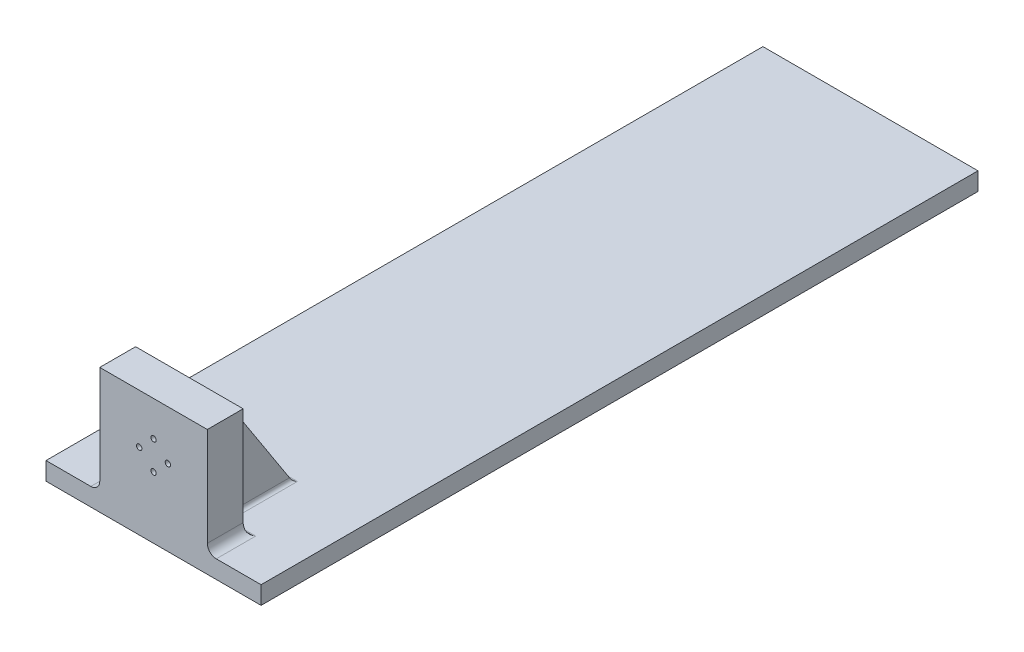
ISO-10303-21;
HEADER;
FILE_DESCRIPTION(('STEP AP214'),'2;1');
FILE_NAME('part.step','',(''),(''),'','','');
FILE_SCHEMA(('AUTOMOTIVE_DESIGN { 1 0 10303 214 1 1 1 1 }'));
ENDSEC;
DATA;
#1=APPLICATION_CONTEXT('core data for automotive mechanical design processes');
#2=APPLICATION_PROTOCOL_DEFINITION('international standard','automotive_design',2000,#1);
#3=PRODUCT_CONTEXT('',#1,'mechanical');
#4=PRODUCT('Part','Part','',(#3));
#5=PRODUCT_RELATED_PRODUCT_CATEGORY('part','',(#4));
#6=PRODUCT_DEFINITION_FORMATION('','',#4);
#7=PRODUCT_DEFINITION_CONTEXT('part definition',#1,'design');
#8=PRODUCT_DEFINITION('design','',#6,#7);
#9=PRODUCT_DEFINITION_SHAPE('','',#8);
#10=(LENGTH_UNIT() NAMED_UNIT(*) SI_UNIT(.MILLI.,.METRE.));
#11=(NAMED_UNIT(*) PLANE_ANGLE_UNIT() SI_UNIT($,.RADIAN.));
#12=(NAMED_UNIT(*) SI_UNIT($,.STERADIAN.) SOLID_ANGLE_UNIT());
#13=UNCERTAINTY_MEASURE_WITH_UNIT(LENGTH_MEASURE(1.E-05),#10,'distance_accuracy_value','');
#14=(GEOMETRIC_REPRESENTATION_CONTEXT(3) GLOBAL_UNCERTAINTY_ASSIGNED_CONTEXT((#13)) GLOBAL_UNIT_ASSIGNED_CONTEXT((#10,
#11,#12)) REPRESENTATION_CONTEXT('',''));
#15=CARTESIAN_POINT('',(0.,0.,0.));
#16=DIRECTION('',(0.,0.,1.));
#17=DIRECTION('',(1.,0.,0.));
#18=AXIS2_PLACEMENT_3D('',#15,#16,#17);
#19=CARTESIAN_POINT('',(-30.,70.,180.));
#20=DIRECTION('',(0.,0.,1.));
#21=DIRECTION('',(1.,0.,0.));
#22=AXIS2_PLACEMENT_3D('',#19,#20,#21);
#23=PLANE('',#22);
#24=CARTESIAN_POINT('',(0.,50.5,180.));
#25=DIRECTION('',(0.,0.,1.));
#26=DIRECTION('',(1.,0.,0.));
#27=AXIS2_PLACEMENT_3D('',#24,#25,#26);
#28=CIRCLE('',#27,1.5);
#29=CARTESIAN_POINT('',(1.50000000000009,50.5,180.));
#30=VERTEX_POINT('',#29);
#31=EDGE_CURVE('E341',#30,#30,#28,.T.);
#32=ORIENTED_EDGE('',*,*,#31,.T.);
#33=EDGE_LOOP('',(#32));
#34=FACE_BOUND('',#33,.T.);
#35=CARTESIAN_POINT('',(-7.9999999999999,42.5,180.));
#36=DIRECTION('',(0.,0.,1.));
#37=DIRECTION('',(1.,0.,0.));
#38=AXIS2_PLACEMENT_3D('',#35,#36,#37);
#39=CIRCLE('',#38,1.5);
#40=CARTESIAN_POINT('',(-6.4999999999999,42.5,180.));
#41=VERTEX_POINT('',#40);
#42=EDGE_CURVE('E337',#41,#41,#39,.T.);
#43=ORIENTED_EDGE('',*,*,#42,.T.);
#44=EDGE_LOOP('',(#43));
#45=FACE_BOUND('',#44,.T.);
#46=CARTESIAN_POINT('',(0.,34.5,180.));
#47=DIRECTION('',(0.,0.,1.));
#48=DIRECTION('',(1.,0.,0.));
#49=AXIS2_PLACEMENT_3D('',#46,#47,#48);
#50=CIRCLE('',#49,1.5);
#51=CARTESIAN_POINT('',(1.50000000000009,34.5,180.));
#52=VERTEX_POINT('',#51);
#53=EDGE_CURVE('E332',#52,#52,#50,.T.);
#54=ORIENTED_EDGE('',*,*,#53,.T.);
#55=EDGE_LOOP('',(#54));
#56=FACE_BOUND('',#55,.T.);
#57=CARTESIAN_POINT('',(7.99999999999996,42.5,180.));
#58=DIRECTION('',(0.,0.,1.));
#59=DIRECTION('',(1.,0.,0.));
#60=AXIS2_PLACEMENT_3D('',#57,#58,#59);
#61=CIRCLE('',#60,1.5);
#62=CARTESIAN_POINT('',(9.49999999999996,42.5,180.));
#63=VERTEX_POINT('',#62);
#64=EDGE_CURVE('E328',#63,#63,#61,.T.);
#65=ORIENTED_EDGE('',*,*,#64,.T.);
#66=EDGE_LOOP('',(#65));
#67=FACE_BOUND('',#66,.T.);
#68=DIRECTION('',(-1.,0.,0.));
#69=VECTOR('',#68,1.);
#70=CARTESIAN_POINT('',(-30.,12.,180.));
#71=LINE('',#70,#69);
#72=CARTESIAN_POINT('',(9.75000000000004,12.,180.));
#73=VERTEX_POINT('',#72);
#74=CARTESIAN_POINT('',(-9.75000000000004,12.,180.));
#75=VERTEX_POINT('',#74);
#76=EDGE_CURVE('E393',#73,#75,#71,.T.);
#77=ORIENTED_EDGE('',*,*,#76,.T.);
#78=DIRECTION('',(0.,-1.,0.));
#79=VECTOR('',#78,1.);
#80=CARTESIAN_POINT('',(-9.75000000000004,70.,180.));
#81=LINE('',#80,#79);
#82=CARTESIAN_POINT('',(-9.75000000000004,70.,180.));
#83=VERTEX_POINT('',#82);
#84=EDGE_CURVE('E396',#75,#83,#81,.F.);
#85=ORIENTED_EDGE('',*,*,#84,.T.);
#86=DIRECTION('',(-1.,0.,0.));
#87=VECTOR('',#86,1.);
#88=CARTESIAN_POINT('',(-30.,70.,180.));
#89=LINE('',#88,#87);
#90=CARTESIAN_POINT('',(9.75000000000004,70.,180.));
#91=VERTEX_POINT('',#90);
#92=EDGE_CURVE('E231',#91,#83,#89,.T.);
#93=ORIENTED_EDGE('',*,*,#92,.F.);
#94=DIRECTION('',(0.,1.,0.));
#95=VECTOR('',#94,1.);
#96=CARTESIAN_POINT('',(9.75000000000004,10.,180.));
#97=LINE('',#96,#95);
#98=EDGE_CURVE('E390',#91,#73,#97,.F.);
#99=ORIENTED_EDGE('',*,*,#98,.T.);
#100=EDGE_LOOP('',(#77,#85,#93,#99));
#101=FACE_BOUND('',#100,.T.);
#102=ADVANCED_FACE('F47',(#34,#45,#56,#67,#101),#23,.F.);
#103=CARTESIAN_POINT('',(-20.25,70.,180.));
#104=VERTEX_POINT('',#103);
#105=CARTESIAN_POINT('',(-30.,70.,180.));
#106=VERTEX_POINT('',#105);
#107=EDGE_CURVE('E241',#104,#106,#89,.T.);
#108=ORIENTED_EDGE('',*,*,#107,.F.);
#109=DIRECTION('',(0.,-1.,0.));
#110=VECTOR('',#109,1.);
#111=CARTESIAN_POINT('',(-20.25,70.,180.));
#112=LINE('',#111,#110);
#113=CARTESIAN_POINT('',(-20.25,10.,180.));
#114=VERTEX_POINT('',#113);
#115=EDGE_CURVE('E375',#104,#114,#112,.T.);
#116=ORIENTED_EDGE('',*,*,#115,.T.);
#117=DIRECTION('',(-1.,0.,0.));
#118=VECTOR('',#117,1.);
#119=CARTESIAN_POINT('',(-30.,10.,180.));
#120=LINE('',#119,#118);
#121=CARTESIAN_POINT('',(-35.,10.,180.));
#122=VERTEX_POINT('',#121);
#123=EDGE_CURVE('E242',#114,#122,#120,.T.);
#124=ORIENTED_EDGE('',*,*,#123,.T.);
#125=CARTESIAN_POINT('',(-35.,15.,180.));
#126=DIRECTION('',(0.,0.,1.));
#127=DIRECTION('',(1.,0.,0.));
#128=AXIS2_PLACEMENT_3D('',#125,#126,#127);
#129=CIRCLE('',#128,5.);
#130=CARTESIAN_POINT('',(-30.,15.,180.));
#131=VERTEX_POINT('',#130);
#132=EDGE_CURVE('E324',#122,#131,#129,.T.);
#133=ORIENTED_EDGE('',*,*,#132,.T.);
#134=DIRECTION('',(0.,-1.,0.));
#135=VECTOR('',#134,1.);
#136=CARTESIAN_POINT('',(-30.,70.,180.));
#137=LINE('',#136,#135);
#138=EDGE_CURVE('E250',#106,#131,#137,.T.);
#139=ORIENTED_EDGE('',*,*,#138,.F.);
#140=EDGE_LOOP('',(#108,#116,#124,#133,#139));
#141=FACE_BOUND('',#140,.T.);
#142=ADVANCED_FACE('F503',(#141),#23,.F.);
#143=CARTESIAN_POINT('',(60.,0.,200.));
#144=DIRECTION('',(1.,0.,0.));
#145=DIRECTION('',(0.,0.,-1.));
#146=AXIS2_PLACEMENT_3D('',#143,#144,#145);
#147=PLANE('',#146);
#148=DIRECTION('',(0.,1.,0.));
#149=VECTOR('',#148,1.);
#150=CARTESIAN_POINT('',(60.,0.,200.));
#151=LINE('',#150,#149);
#152=CARTESIAN_POINT('',(60.,0.,200.));
#153=VERTEX_POINT('',#152);
#154=CARTESIAN_POINT('',(60.,10.,200.));
#155=VERTEX_POINT('',#154);
#156=EDGE_CURVE('E296',#153,#155,#151,.T.);
#157=ORIENTED_EDGE('',*,*,#156,.F.);
#158=DIRECTION('',(0.,0.,-1.));
#159=VECTOR('',#158,1.);
#160=CARTESIAN_POINT('',(60.,0.,200.));
#161=LINE('',#160,#159);
#162=CARTESIAN_POINT('',(60.,0.,-200.));
#163=VERTEX_POINT('',#162);
#164=EDGE_CURVE('E283',#153,#163,#161,.T.);
#165=ORIENTED_EDGE('',*,*,#164,.T.);
#166=DIRECTION('',(0.,1.,0.));
#167=VECTOR('',#166,1.);
#168=CARTESIAN_POINT('',(60.,0.,-200.));
#169=LINE('',#168,#167);
#170=CARTESIAN_POINT('',(60.,10.,-200.));
#171=VERTEX_POINT('',#170);
#172=EDGE_CURVE('E293',#163,#171,#169,.T.);
#173=ORIENTED_EDGE('',*,*,#172,.T.);
#174=DIRECTION('',(0.,0.,1.));
#175=VECTOR('',#174,1.);
#176=CARTESIAN_POINT('',(60.,10.,0.));
#177=LINE('',#176,#175);
#178=EDGE_CURVE('E273',#155,#171,#177,.F.);
#179=ORIENTED_EDGE('',*,*,#178,.F.);
#180=EDGE_LOOP('',(#157,#165,#173,#179));
#181=FACE_BOUND('',#180,.T.);
#182=ADVANCED_FACE('F510',(#181),#147,.T.);
#183=CARTESIAN_POINT('',(60.,0.,-200.));
#184=DIRECTION('',(0.,0.,-1.));
#185=DIRECTION('',(-1.,0.,0.));
#186=AXIS2_PLACEMENT_3D('',#183,#184,#185);
#187=PLANE('',#186);
#188=ORIENTED_EDGE('',*,*,#172,.F.);
#189=DIRECTION('',(-1.,0.,0.));
#190=VECTOR('',#189,1.);
#191=CARTESIAN_POINT('',(60.,0.,-200.));
#192=LINE('',#191,#190);
#193=CARTESIAN_POINT('',(-60.,0.,-200.));
#194=VERTEX_POINT('',#193);
#195=EDGE_CURVE('E267',#163,#194,#192,.T.);
#196=ORIENTED_EDGE('',*,*,#195,.T.);
#197=DIRECTION('',(0.,1.,0.));
#198=VECTOR('',#197,1.);
#199=CARTESIAN_POINT('',(-60.,0.,-200.));
#200=LINE('',#199,#198);
#201=CARTESIAN_POINT('',(-60.,10.,-200.));
#202=VERTEX_POINT('',#201);
#203=EDGE_CURVE('E290',#194,#202,#200,.T.);
#204=ORIENTED_EDGE('',*,*,#203,.T.);
#205=DIRECTION('',(1.,0.,0.));
#206=VECTOR('',#205,1.);
#207=CARTESIAN_POINT('',(0.,10.,-200.));
#208=LINE('',#207,#206);
#209=EDGE_CURVE('E268',#171,#202,#208,.F.);
#210=ORIENTED_EDGE('',*,*,#209,.F.);
#211=EDGE_LOOP('',(#188,#196,#204,#210));
#212=FACE_BOUND('',#211,.T.);
#213=ADVANCED_FACE('F536',(#212),#187,.T.);
#214=CARTESIAN_POINT('',(-60.,0.,200.));
#215=DIRECTION('',(-1.,0.,0.));
#216=DIRECTION('',(0.,0.,1.));
#217=AXIS2_PLACEMENT_3D('',#214,#215,#216);
#218=PLANE('',#217);
#219=ORIENTED_EDGE('',*,*,#203,.F.);
#220=DIRECTION('',(0.,0.,1.));
#221=VECTOR('',#220,1.);
#222=CARTESIAN_POINT('',(-60.,0.,200.));
#223=LINE('',#222,#221);
#224=CARTESIAN_POINT('',(-60.,0.,200.));
#225=VERTEX_POINT('',#224);
#226=EDGE_CURVE('E249',#194,#225,#223,.T.);
#227=ORIENTED_EDGE('',*,*,#226,.T.);
#228=DIRECTION('',(0.,1.,0.));
#229=VECTOR('',#228,1.);
#230=CARTESIAN_POINT('',(-60.,0.,200.));
#231=LINE('',#230,#229);
#232=CARTESIAN_POINT('',(-60.,10.,200.));
#233=VERTEX_POINT('',#232);
#234=EDGE_CURVE('E272',#225,#233,#231,.T.);
#235=ORIENTED_EDGE('',*,*,#234,.T.);
#236=DIRECTION('',(0.,0.,1.));
#237=VECTOR('',#236,1.);
#238=CARTESIAN_POINT('',(-60.,10.,0.));
#239=LINE('',#238,#237);
#240=EDGE_CURVE('E262',#202,#233,#239,.T.);
#241=ORIENTED_EDGE('',*,*,#240,.F.);
#242=EDGE_LOOP('',(#219,#227,#235,#241));
#243=FACE_BOUND('',#242,.T.);
#244=ADVANCED_FACE('F534',(#243),#218,.T.);
#245=CARTESIAN_POINT('',(60.,0.,200.));
#246=DIRECTION('',(0.,0.,1.));
#247=DIRECTION('',(1.,0.,0.));
#248=AXIS2_PLACEMENT_3D('',#245,#246,#247);
#249=PLANE('',#248);
#250=DIRECTION('',(1.,0.,0.));
#251=VECTOR('',#250,1.);
#252=CARTESIAN_POINT('',(60.,0.,200.));
#253=LINE('',#252,#251);
#254=EDGE_CURVE('E255',#225,#153,#253,.T.);
#255=ORIENTED_EDGE('',*,*,#254,.T.);
#256=ORIENTED_EDGE('',*,*,#156,.T.);
#257=DIRECTION('',(1.,0.,0.));
#258=VECTOR('',#257,1.);
#259=CARTESIAN_POINT('',(0.,10.,200.));
#260=LINE('',#259,#258);
#261=CARTESIAN_POINT('',(35.,10.,200.));
#262=VERTEX_POINT('',#261);
#263=EDGE_CURVE('E266',#262,#155,#260,.T.);
#264=ORIENTED_EDGE('',*,*,#263,.F.);
#265=CARTESIAN_POINT('',(35.,15.,200.));
#266=DIRECTION('',(0.,0.,1.));
#267=DIRECTION('',(1.,0.,0.));
#268=AXIS2_PLACEMENT_3D('',#265,#266,#267);
#269=CIRCLE('',#268,5.);
#270=CARTESIAN_POINT('',(30.0000000000001,15.,200.));
#271=VERTEX_POINT('',#270);
#272=EDGE_CURVE('E318',#262,#271,#269,.F.);
#273=ORIENTED_EDGE('',*,*,#272,.T.);
#274=DIRECTION('',(0.,-1.,0.));
#275=VECTOR('',#274,1.);
#276=CARTESIAN_POINT('',(30.0000000000001,70.,200.));
#277=LINE('',#276,#275);
#278=CARTESIAN_POINT('',(30.0000000000001,70.,200.));
#279=VERTEX_POINT('',#278);
#280=EDGE_CURVE('E649',#279,#271,#277,.T.);
#281=ORIENTED_EDGE('',*,*,#280,.F.);
#282=DIRECTION('',(1.,0.,0.));
#283=VECTOR('',#282,1.);
#284=CARTESIAN_POINT('',(-30.,70.,200.));
#285=LINE('',#284,#283);
#286=CARTESIAN_POINT('',(-30.,70.,200.));
#287=VERTEX_POINT('',#286);
#288=EDGE_CURVE('E236',#287,#279,#285,.T.);
#289=ORIENTED_EDGE('',*,*,#288,.F.);
#290=DIRECTION('',(0.,-1.,0.));
#291=VECTOR('',#290,1.);
#292=CARTESIAN_POINT('',(-30.,70.,200.));
#293=LINE('',#292,#291);
#294=CARTESIAN_POINT('',(-30.,15.,200.));
#295=VERTEX_POINT('',#294);
#296=EDGE_CURVE('E258',#287,#295,#293,.T.);
#297=ORIENTED_EDGE('',*,*,#296,.T.);
#298=CARTESIAN_POINT('',(-35.,15.,200.));
#299=DIRECTION('',(0.,0.,1.));
#300=DIRECTION('',(1.,0.,0.));
#301=AXIS2_PLACEMENT_3D('',#298,#299,#300);
#302=CIRCLE('',#301,5.);
#303=CARTESIAN_POINT('',(-35.,10.,200.));
#304=VERTEX_POINT('',#303);
#305=EDGE_CURVE('E321',#295,#304,#302,.F.);
#306=ORIENTED_EDGE('',*,*,#305,.T.);
#307=EDGE_CURVE('E277',#233,#304,#260,.T.);
#308=ORIENTED_EDGE('',*,*,#307,.F.);
#309=ORIENTED_EDGE('',*,*,#234,.F.);
#310=EDGE_LOOP('',(#255,#256,#264,#273,#281,#289,#297,#306,#308,#309));
#311=FACE_BOUND('',#310,.T.);
#312=CARTESIAN_POINT('',(0.,50.5,200.));
#313=DIRECTION('',(0.,0.,1.));
#314=DIRECTION('',(1.,0.,0.));
#315=AXIS2_PLACEMENT_3D('',#312,#313,#314);
#316=CIRCLE('',#315,1.5);
#317=CARTESIAN_POINT('',(1.50000000000009,50.5,200.));
#318=VERTEX_POINT('',#317);
#319=EDGE_CURVE('E333',#318,#318,#316,.T.);
#320=ORIENTED_EDGE('',*,*,#319,.F.);
#321=EDGE_LOOP('',(#320));
#322=FACE_BOUND('',#321,.T.);
#323=CARTESIAN_POINT('',(-7.9999999999999,42.5,200.));
#324=DIRECTION('',(0.,0.,1.));
#325=DIRECTION('',(1.,0.,0.));
#326=AXIS2_PLACEMENT_3D('',#323,#324,#325);
#327=CIRCLE('',#326,1.5);
#328=CARTESIAN_POINT('',(-6.4999999999999,42.5,200.));
#329=VERTEX_POINT('',#328);
#330=EDGE_CURVE('E634',#329,#329,#327,.T.);
#331=ORIENTED_EDGE('',*,*,#330,.F.);
#332=EDGE_LOOP('',(#331));
#333=FACE_BOUND('',#332,.T.);
#334=CARTESIAN_POINT('',(0.,34.5,200.));
#335=DIRECTION('',(0.,0.,1.));
#336=DIRECTION('',(-1.,0.,0.));
#337=AXIS2_PLACEMENT_3D('',#334,#335,#336);
#338=CIRCLE('',#337,1.5);
#339=CARTESIAN_POINT('',(-1.49999999999991,34.5,200.));
#340=VERTEX_POINT('',#339);
#341=EDGE_CURVE('E638',#340,#340,#338,.T.);
#342=ORIENTED_EDGE('',*,*,#341,.F.);
#343=EDGE_LOOP('',(#342));
#344=FACE_BOUND('',#343,.T.);
#345=CARTESIAN_POINT('',(7.99999999999996,42.5,200.));
#346=DIRECTION('',(0.,0.,1.));
#347=DIRECTION('',(-1.,0.,0.));
#348=AXIS2_PLACEMENT_3D('',#345,#346,#347);
#349=CIRCLE('',#348,1.5);
#350=CARTESIAN_POINT('',(6.49999999999996,42.5,200.));
#351=VERTEX_POINT('',#350);
#352=EDGE_CURVE('E627',#351,#351,#349,.T.);
#353=ORIENTED_EDGE('',*,*,#352,.F.);
#354=EDGE_LOOP('',(#353));
#355=FACE_BOUND('',#354,.T.);
#356=ADVANCED_FACE('F461',(#311,#322,#333,#344,#355),#249,.T.);
#357=CARTESIAN_POINT('',(0.,10.,0.));
#358=DIRECTION('',(0.,1.,0.));
#359=DIRECTION('',(0.,0.,1.));
#360=AXIS2_PLACEMENT_3D('',#357,#358,#359);
#361=PLANE('',#360);
#362=ORIENTED_EDGE('',*,*,#123,.F.);
#363=DIRECTION('',(0.,0.,1.));
#364=VECTOR('',#363,1.);
#365=CARTESIAN_POINT('',(-20.25,10.,141.081350869608));
#366=LINE('',#365,#364);
#367=CARTESIAN_POINT('',(-20.25,10.,139.994743843913));
#368=VERTEX_POINT('',#367);
#369=EDGE_CURVE('E369',#114,#368,#366,.F.);
#370=ORIENTED_EDGE('',*,*,#369,.T.);
#371=DIRECTION('',(-1.,0.,0.));
#372=VECTOR('',#371,1.);
#373=CARTESIAN_POINT('',(-11.75,10.,139.994743843913));
#374=LINE('',#373,#372);
#375=CARTESIAN_POINT('',(-9.75000000000003,10.,139.994743843913));
#376=VERTEX_POINT('',#375);
#377=EDGE_CURVE('E366',#368,#376,#374,.F.);
#378=ORIENTED_EDGE('',*,*,#377,.T.);
#379=DIRECTION('',(0.,0.,1.));
#380=VECTOR('',#379,1.);
#381=CARTESIAN_POINT('',(-9.75000000000001,10.,0.));
#382=LINE('',#381,#380);
#383=CARTESIAN_POINT('',(-9.75000000000004,10.,178.));
#384=VERTEX_POINT('',#383);
#385=EDGE_CURVE('E363',#376,#384,#382,.T.);
#386=ORIENTED_EDGE('',*,*,#385,.T.);
#387=DIRECTION('',(-1.,0.,0.));
#388=VECTOR('',#387,1.);
#389=CARTESIAN_POINT('',(0.,10.,178.));
#390=LINE('',#389,#388);
#391=CARTESIAN_POINT('',(9.75000000000004,10.,178.));
#392=VERTEX_POINT('',#391);
#393=EDGE_CURVE('E360',#384,#392,#390,.F.);
#394=ORIENTED_EDGE('',*,*,#393,.T.);
#395=DIRECTION('',(0.,0.,-1.));
#396=VECTOR('',#395,1.);
#397=CARTESIAN_POINT('',(9.75000000000001,10.,0.));
#398=LINE('',#397,#396);
#399=CARTESIAN_POINT('',(9.75000000000003,10.,139.994743843913));
#400=VERTEX_POINT('',#399);
#401=EDGE_CURVE('E357',#392,#400,#398,.T.);
#402=ORIENTED_EDGE('',*,*,#401,.T.);
#403=DIRECTION('',(1.,0.,0.));
#404=VECTOR('',#403,1.);
#405=CARTESIAN_POINT('',(18.25,10.,139.994743843913));
#406=LINE('',#405,#404);
#407=CARTESIAN_POINT('',(20.25,10.,139.994743843913));
#408=VERTEX_POINT('',#407);
#409=EDGE_CURVE('E354',#400,#408,#406,.T.);
#410=ORIENTED_EDGE('',*,*,#409,.T.);
#411=DIRECTION('',(0.,0.,-1.));
#412=VECTOR('',#411,1.);
#413=CARTESIAN_POINT('',(20.25,10.,180.));
#414=LINE('',#413,#412);
#415=CARTESIAN_POINT('',(20.25,10.,178.));
#416=VERTEX_POINT('',#415);
#417=EDGE_CURVE('E351',#408,#416,#414,.F.);
#418=ORIENTED_EDGE('',*,*,#417,.T.);
#419=DIRECTION('',(-1.,0.,0.));
#420=VECTOR('',#419,1.);
#421=CARTESIAN_POINT('',(0.,10.,178.));
#422=LINE('',#421,#420);
#423=CARTESIAN_POINT('',(35.,10.,178.));
#424=VERTEX_POINT('',#423);
#425=EDGE_CURVE('E347',#416,#424,#422,.F.);
#426=ORIENTED_EDGE('',*,*,#425,.T.);
#427=DIRECTION('',(0.,0.,-1.));
#428=VECTOR('',#427,1.);
#429=CARTESIAN_POINT('',(35.,10.,0.));
#430=LINE('',#429,#428);
#431=EDGE_CURVE('E308',#424,#262,#430,.F.);
#432=ORIENTED_EDGE('',*,*,#431,.T.);
#433=ORIENTED_EDGE('',*,*,#263,.T.);
#434=ORIENTED_EDGE('',*,*,#178,.T.);
#435=ORIENTED_EDGE('',*,*,#209,.T.);
#436=ORIENTED_EDGE('',*,*,#240,.T.);
#437=ORIENTED_EDGE('',*,*,#307,.T.);
#438=DIRECTION('',(0.,0.,1.));
#439=VECTOR('',#438,1.);
#440=CARTESIAN_POINT('',(-35.,10.,0.));
#441=LINE('',#440,#439);
#442=EDGE_CURVE('E304',#304,#122,#441,.F.);
#443=ORIENTED_EDGE('',*,*,#442,.T.);
#444=EDGE_LOOP('',(#362,#370,#378,#386,#394,#402,#410,#418,#426,#432,#433,#434,#435,#436,#437,#443));
#445=FACE_BOUND('',#444,.T.);
#446=ADVANCED_FACE('F528',(#445),#361,.T.);
#447=CARTESIAN_POINT('',(0.,0.,0.));
#448=DIRECTION('',(0.,1.,0.));
#449=DIRECTION('',(0.,0.,1.));
#450=AXIS2_PLACEMENT_3D('',#447,#448,#449);
#451=PLANE('',#450);
#452=ORIENTED_EDGE('',*,*,#164,.F.);
#453=ORIENTED_EDGE('',*,*,#254,.F.);
#454=ORIENTED_EDGE('',*,*,#226,.F.);
#455=ORIENTED_EDGE('',*,*,#195,.F.);
#456=EDGE_LOOP('',(#452,#453,#454,#455));
#457=FACE_BOUND('',#456,.T.);
#458=ADVANCED_FACE('F524',(#457),#451,.F.);
#459=CARTESIAN_POINT('',(30.,70.,180.));
#460=DIRECTION('',(-1.,0.,0.));
#461=DIRECTION('',(0.,0.,1.));
#462=AXIS2_PLACEMENT_3D('',#459,#460,#461);
#463=PLANE('',#462);
#464=ORIENTED_EDGE('',*,*,#280,.T.);
#465=DIRECTION('',(0.,0.,-1.));
#466=VECTOR('',#465,1.);
#467=CARTESIAN_POINT('',(30.,15.,180.));
#468=LINE('',#467,#466);
#469=CARTESIAN_POINT('',(30.,15.,180.));
#470=VERTEX_POINT('',#469);
#471=EDGE_CURVE('E247',#271,#470,#468,.T.);
#472=ORIENTED_EDGE('',*,*,#471,.T.);
#473=DIRECTION('',(0.,-1.,0.));
#474=VECTOR('',#473,1.);
#475=CARTESIAN_POINT('',(30.,70.,180.));
#476=LINE('',#475,#474);
#477=CARTESIAN_POINT('',(30.,70.,180.));
#478=VERTEX_POINT('',#477);
#479=EDGE_CURVE('E224',#478,#470,#476,.T.);
#480=ORIENTED_EDGE('',*,*,#479,.F.);
#481=DIRECTION('',(0.,0.,-1.));
#482=VECTOR('',#481,1.);
#483=CARTESIAN_POINT('',(30.,70.,180.));
#484=LINE('',#483,#482);
#485=EDGE_CURVE('E233',#279,#478,#484,.T.);
#486=ORIENTED_EDGE('',*,*,#485,.F.);
#487=EDGE_LOOP('',(#464,#472,#480,#486));
#488=FACE_BOUND('',#487,.T.);
#489=ADVANCED_FACE('F245',(#488),#463,.F.);
#490=CARTESIAN_POINT('',(35.,15.,180.));
#491=DIRECTION('',(0.,0.,1.));
#492=DIRECTION('',(1.,0.,0.));
#493=AXIS2_PLACEMENT_3D('',#490,#491,#492);
#494=CIRCLE('',#493,5.);
#495=CARTESIAN_POINT('',(31.,12.,180.));
#496=VERTEX_POINT('',#495);
#497=EDGE_CURVE('E315',#470,#496,#494,.T.);
#498=ORIENTED_EDGE('',*,*,#497,.T.);
#499=DIRECTION('',(-1.,0.,0.));
#500=VECTOR('',#499,1.);
#501=CARTESIAN_POINT('',(-30.,12.,180.));
#502=LINE('',#501,#500);
#503=CARTESIAN_POINT('',(20.25,12.,180.));
#504=VERTEX_POINT('',#503);
#505=EDGE_CURVE('E414',#496,#504,#502,.T.);
#506=ORIENTED_EDGE('',*,*,#505,.T.);
#507=DIRECTION('',(0.,1.,0.));
#508=VECTOR('',#507,1.);
#509=CARTESIAN_POINT('',(20.25,70.,180.));
#510=LINE('',#509,#508);
#511=CARTESIAN_POINT('',(20.25,70.,180.));
#512=VERTEX_POINT('',#511);
#513=EDGE_CURVE('E226',#504,#512,#510,.T.);
#514=ORIENTED_EDGE('',*,*,#513,.T.);
#515=EDGE_CURVE('E219',#478,#512,#89,.T.);
#516=ORIENTED_EDGE('',*,*,#515,.F.);
#517=ORIENTED_EDGE('',*,*,#479,.T.);
#518=EDGE_LOOP('',(#498,#506,#514,#516,#517));
#519=FACE_BOUND('',#518,.T.);
#520=ADVANCED_FACE('F222',(#519),#23,.F.);
#521=CARTESIAN_POINT('',(-30.,70.,180.));
#522=DIRECTION('',(1.,0.,0.));
#523=DIRECTION('',(0.,0.,-1.));
#524=AXIS2_PLACEMENT_3D('',#521,#522,#523);
#525=PLANE('',#524);
#526=ORIENTED_EDGE('',*,*,#138,.T.);
#527=DIRECTION('',(0.,0.,1.));
#528=VECTOR('',#527,1.);
#529=CARTESIAN_POINT('',(-30.,15.,180.));
#530=LINE('',#529,#528);
#531=EDGE_CURVE('E311',#131,#295,#530,.T.);
#532=ORIENTED_EDGE('',*,*,#531,.T.);
#533=ORIENTED_EDGE('',*,*,#296,.F.);
#534=DIRECTION('',(0.,0.,1.));
#535=VECTOR('',#534,1.);
#536=CARTESIAN_POINT('',(-30.,70.,180.));
#537=LINE('',#536,#535);
#538=EDGE_CURVE('E229',#106,#287,#537,.T.);
#539=ORIENTED_EDGE('',*,*,#538,.F.);
#540=EDGE_LOOP('',(#526,#532,#533,#539));
#541=FACE_BOUND('',#540,.T.);
#542=ADVANCED_FACE('F516',(#541),#525,.F.);
#543=CARTESIAN_POINT('',(0.,70.,0.));
#544=DIRECTION('',(0.,1.,0.));
#545=DIRECTION('',(0.,0.,1.));
#546=AXIS2_PLACEMENT_3D('',#543,#544,#545);
#547=PLANE('',#546);
#548=ORIENTED_EDGE('',*,*,#288,.T.);
#549=ORIENTED_EDGE('',*,*,#485,.T.);
#550=ORIENTED_EDGE('',*,*,#515,.T.);
#551=EDGE_CURVE('E66',#512,#91,#89,.T.);
#552=ORIENTED_EDGE('',*,*,#551,.T.);
#553=ORIENTED_EDGE('',*,*,#92,.T.);
#554=EDGE_CURVE('E715',#83,#104,#89,.T.);
#555=ORIENTED_EDGE('',*,*,#554,.T.);
#556=ORIENTED_EDGE('',*,*,#107,.T.);
#557=ORIENTED_EDGE('',*,*,#538,.T.);
#558=EDGE_LOOP('',(#548,#549,#550,#552,#553,#555,#556,#557));
#559=FACE_BOUND('',#558,.T.);
#560=ADVANCED_FACE('F234',(#559),#547,.T.);
#561=CARTESIAN_POINT('',(35.,15.,180.));
#562=DIRECTION('',(0.,0.,-1.));
#563=DIRECTION('',(-1.,0.,0.));
#564=AXIS2_PLACEMENT_3D('',#561,#562,#563);
#565=CYLINDRICAL_SURFACE('',#564,5.);
#566=ORIENTED_EDGE('',*,*,#272,.F.);
#567=ORIENTED_EDGE('',*,*,#431,.F.);
#568=CARTESIAN_POINT('',(31.,12.,180.));
#569=CARTESIAN_POINT('',(31.051291938938,11.9315858443193,179.999993240273));
#570=CARTESIAN_POINT('',(31.1043221905044,11.8645582185277,179.996491572034));
#571=CARTESIAN_POINT('',(31.2133273103346,11.7337630195359,179.983289097096));
#572=CARTESIAN_POINT('',(31.2692969306262,11.6699900118236,179.9735990156));
#573=CARTESIAN_POINT('',(31.3832847643709,11.5465415072406,179.948922812718));
#574=CARTESIAN_POINT('',(31.4412784471596,11.4868328230552,179.933987909531));
#575=CARTESIAN_POINT('',(31.5594732382407,11.3710020267293,179.899477725159));
#576=CARTESIAN_POINT('',(31.6196756241122,11.3148820435623,179.87989972132));
#577=CARTESIAN_POINT('',(31.767891438032,11.1833228460575,179.827555850942));
#578=CARTESIAN_POINT('',(31.856869793661,11.1097861813867,179.792718575294));
#579=CARTESIAN_POINT('',(32.0378149034014,10.9702943076288,179.716399415194));
#580=CARTESIAN_POINT('',(32.1297823955073,10.9043409893311,179.674915879745));
#581=CARTESIAN_POINT('',(32.410325680535,10.7169733012532,179.541888780418));
#582=CARTESIAN_POINT('',(32.6026488108277,10.6068318494825,179.442106107314));
#583=CARTESIAN_POINT('',(32.936006808688,10.4432848498546,179.259736400756));
#584=CARTESIAN_POINT('',(33.0756041550305,10.3827054455412,179.180646510725));
#585=CARTESIAN_POINT('',(33.3570864580454,10.2752228503533,179.017206242058));
#586=CARTESIAN_POINT('',(33.4989723932581,10.2283256825108,178.932853566475));
#587=CARTESIAN_POINT('',(33.7839512736836,10.1478758852136,178.76068856634));
#588=CARTESIAN_POINT('',(33.9270410934604,10.1142956946986,178.672883804921));
#589=CARTESIAN_POINT('',(34.2141274184521,10.0599857310582,178.494967808666));
#590=CARTESIAN_POINT('',(34.3581236186315,10.0392518461052,178.404857321471));
#591=CARTESIAN_POINT('',(34.6640741180227,10.0086525171965,178.212445214318));
#592=CARTESIAN_POINT('',(34.8260977800034,10.0004013073906,178.109985110391));
#593=CARTESIAN_POINT('',(34.9920318535134,10.0000047645927,178.005039497681));
#594=CARTESIAN_POINT('',(34.9960159521506,10.0000000029522,178.002519732425));
#595=CARTESIAN_POINT('',(35.,10.,178.));
#596=B_SPLINE_CURVE_WITH_KNOTS('',3,(#568,#569,#570,#571,#572,#573,#574,#575,#576,#577,#578,
#579,#580,#581,#582,#583,#584,#585,#586,#587,#588,#589,#590,#591,#592,#593,#594,#595),
.UNSPECIFIED.,.F.,.F.,(4,2,2,2,2,2,2,2,2,2,2,2,2,4),(0.,0.256323586120825,0.512204136350837,
0.765652360303645,1.01924957198093,1.38041574025915,1.74167176531578,2.4678409679054,
2.98178501814792,3.4959549705634,4.00905516339227,4.52199103886934,5.09684964624111,
5.11099178908029),.UNSPECIFIED.);
#597=EDGE_CURVE('E58',#424,#496,#596,.F.);
#598=ORIENTED_EDGE('',*,*,#597,.T.);
#599=ORIENTED_EDGE('',*,*,#497,.F.);
#600=ORIENTED_EDGE('',*,*,#471,.F.);
#601=EDGE_LOOP('',(#566,#567,#598,#599,#600));
#602=FACE_BOUND('',#601,.T.);
#603=ADVANCED_FACE('F454',(#602),#565,.F.);
#604=CARTESIAN_POINT('',(-35.,15.,180.));
#605=DIRECTION('',(0.,0.,1.));
#606=DIRECTION('',(1.,0.,0.));
#607=AXIS2_PLACEMENT_3D('',#604,#605,#606);
#608=CYLINDRICAL_SURFACE('',#607,5.);
#609=ORIENTED_EDGE('',*,*,#132,.F.);
#610=ORIENTED_EDGE('',*,*,#442,.F.);
#611=ORIENTED_EDGE('',*,*,#305,.F.);
#612=ORIENTED_EDGE('',*,*,#531,.F.);
#613=EDGE_LOOP('',(#609,#610,#611,#612));
#614=FACE_BOUND('',#613,.T.);
#615=ADVANCED_FACE('F459',(#614),#608,.F.);
#616=CARTESIAN_POINT('',(7.99999999999996,42.5,169.));
#617=DIRECTION('',(0.,0.,1.));
#618=DIRECTION('',(1.,0.,0.));
#619=AXIS2_PLACEMENT_3D('',#616,#617,#618);
#620=CYLINDRICAL_SURFACE('',#619,1.5);
#621=ORIENTED_EDGE('',*,*,#352,.T.);
#622=EDGE_LOOP('',(#621));
#623=FACE_BOUND('',#622,.T.);
#624=ORIENTED_EDGE('',*,*,#64,.F.);
#625=EDGE_LOOP('',(#624));
#626=FACE_BOUND('',#625,.T.);
#627=ADVANCED_FACE('F465',(#623,#626),#620,.F.);
#628=CARTESIAN_POINT('',(0.,34.5,169.));
#629=DIRECTION('',(0.,0.,1.));
#630=DIRECTION('',(1.,0.,0.));
#631=AXIS2_PLACEMENT_3D('',#628,#629,#630);
#632=CYLINDRICAL_SURFACE('',#631,1.5);
#633=ORIENTED_EDGE('',*,*,#341,.T.);
#634=EDGE_LOOP('',(#633));
#635=FACE_BOUND('',#634,.T.);
#636=ORIENTED_EDGE('',*,*,#53,.F.);
#637=EDGE_LOOP('',(#636));
#638=FACE_BOUND('',#637,.T.);
#639=ADVANCED_FACE('F750',(#635,#638),#632,.F.);
#640=CARTESIAN_POINT('',(-7.9999999999999,42.5,169.));
#641=DIRECTION('',(0.,0.,1.));
#642=DIRECTION('',(1.,0.,0.));
#643=AXIS2_PLACEMENT_3D('',#640,#641,#642);
#644=CYLINDRICAL_SURFACE('',#643,1.5);
#645=ORIENTED_EDGE('',*,*,#330,.T.);
#646=EDGE_LOOP('',(#645));
#647=FACE_BOUND('',#646,.T.);
#648=ORIENTED_EDGE('',*,*,#42,.F.);
#649=EDGE_LOOP('',(#648));
#650=FACE_BOUND('',#649,.T.);
#651=ADVANCED_FACE('F746',(#647,#650),#644,.F.);
#652=CARTESIAN_POINT('',(0.,50.5,169.));
#653=DIRECTION('',(0.,0.,1.));
#654=DIRECTION('',(1.,0.,0.));
#655=AXIS2_PLACEMENT_3D('',#652,#653,#654);
#656=CYLINDRICAL_SURFACE('',#655,1.5);
#657=ORIENTED_EDGE('',*,*,#319,.T.);
#658=EDGE_LOOP('',(#657));
#659=FACE_BOUND('',#658,.T.);
#660=ORIENTED_EDGE('',*,*,#31,.F.);
#661=EDGE_LOOP('',(#660));
#662=FACE_BOUND('',#661,.T.);
#663=ADVANCED_FACE('F743',(#659,#662),#656,.F.);
#664=CARTESIAN_POINT('',(15.,70.,180.));
#665=DIRECTION('',(0.,-0.544188449886251,0.838963009321865));
#666=DIRECTION('',(0.,-0.838963009321865,-0.544188449886251));
#667=AXIS2_PLACEMENT_3D('',#664,#665,#666);
#668=PLANE('',#667);
#669=DIRECTION('',(0.,-0.838963009321865,-0.544188449886251));
#670=VECTOR('',#669,1.);
#671=CARTESIAN_POINT('',(18.25,70.,180.));
#672=LINE('',#671,#670);
#673=CARTESIAN_POINT('',(18.25,66.9166452926473,178.));
#674=VERTEX_POINT('',#673);
#675=CARTESIAN_POINT('',(18.25,12.,142.378639173955));
#676=VERTEX_POINT('',#675);
#677=EDGE_CURVE('E623',#674,#676,#672,.T.);
#678=ORIENTED_EDGE('',*,*,#677,.T.);
#679=CARTESIAN_POINT('',(20.25,12.,142.378639173955));
#680=DIRECTION('',(0.,-0.544188449886251,0.838963009321865));
#681=DIRECTION('',(0.,0.838963009321865,0.544188449886251));
#682=AXIS2_PLACEMENT_3D('',#679,#680,#681);
#683=ELLIPSE('',#682,2.38389533004155,2.);
#684=CARTESIAN_POINT('',(18.5720739813549,10.9116231002275,141.672669862557));
#685=VERTEX_POINT('',#684);
#686=EDGE_CURVE('E438',#676,#685,#683,.T.);
#687=ORIENTED_EDGE('',*,*,#686,.T.);
#688=DIRECTION('',(-1.,0.,0.));
#689=VECTOR('',#688,1.);
#690=CARTESIAN_POINT('',(11.75,10.9116231002275,141.672669862557));
#691=LINE('',#690,#689);
#692=CARTESIAN_POINT('',(11.4279260186452,10.9116231002275,141.672669862557));
#693=VERTEX_POINT('',#692);
#694=EDGE_CURVE('E327',#685,#693,#691,.T.);
#695=ORIENTED_EDGE('',*,*,#694,.T.);
#696=CARTESIAN_POINT('',(9.75000000000003,12.,142.378639173955));
#697=DIRECTION('',(0.,-0.544188449886251,0.838963009321865));
#698=DIRECTION('',(0.,-0.838963009321865,-0.544188449886251));
#699=AXIS2_PLACEMENT_3D('',#696,#697,#698);
#700=ELLIPSE('',#699,2.38389533004155,2.);
#701=CARTESIAN_POINT('',(11.75,12.,142.378639173955));
#702=VERTEX_POINT('',#701);
#703=EDGE_CURVE('E435',#693,#702,#700,.T.);
#704=ORIENTED_EDGE('',*,*,#703,.T.);
#705=DIRECTION('',(0.,-0.838963009321865,-0.544188449886251));
#706=VECTOR('',#705,1.);
#707=CARTESIAN_POINT('',(11.75,70.,180.));
#708=LINE('',#707,#706);
#709=CARTESIAN_POINT('',(11.75,66.9166452926473,178.));
#710=VERTEX_POINT('',#709);
#711=EDGE_CURVE('E620',#710,#702,#708,.T.);
#712=ORIENTED_EDGE('',*,*,#711,.F.);
#713=CARTESIAN_POINT('',(9.75000000000004,66.9166452926473,178.));
#714=DIRECTION('',(0.,-0.544188449886251,0.838963009321865));
#715=DIRECTION('',(0.,-0.838963009321865,-0.544188449886251));
#716=AXIS2_PLACEMENT_3D('',#713,#714,#715);
#717=ELLIPSE('',#716,3.67519744385984,2.);
#718=EDGE_CURVE('E431',#710,#91,#717,.T.);
#719=ORIENTED_EDGE('',*,*,#718,.T.);
#720=ORIENTED_EDGE('',*,*,#551,.F.);
#721=CARTESIAN_POINT('',(20.25,66.9166452926473,178.));
#722=DIRECTION('',(0.,-0.544188449886251,0.838963009321865));
#723=DIRECTION('',(0.,0.838963009321865,0.544188449886251));
#724=AXIS2_PLACEMENT_3D('',#721,#722,#723);
#725=ELLIPSE('',#724,3.67519744385984,2.);
#726=EDGE_CURVE('E11',#512,#674,#725,.T.);
#727=ORIENTED_EDGE('',*,*,#726,.T.);
#728=EDGE_LOOP('',(#678,#687,#695,#704,#712,#719,#720,#727));
#729=FACE_BOUND('',#728,.T.);
#730=ADVANCED_FACE('F710',(#729),#668,.F.);
#731=CARTESIAN_POINT('',(18.25,35.,0.));
#732=DIRECTION('',(1.,0.,0.));
#733=DIRECTION('',(0.,0.,-1.));
#734=AXIS2_PLACEMENT_3D('',#731,#732,#733);
#735=PLANE('',#734);
#736=DIRECTION('',(0.,1.,0.));
#737=VECTOR('',#736,1.);
#738=CARTESIAN_POINT('',(18.25,35.,178.));
#739=LINE('',#738,#737);
#740=CARTESIAN_POINT('',(18.25,12.,178.));
#741=VERTEX_POINT('',#740);
#742=EDGE_CURVE('E406',#674,#741,#739,.F.);
#743=ORIENTED_EDGE('',*,*,#742,.T.);
#744=DIRECTION('',(0.,0.,-1.));
#745=VECTOR('',#744,1.);
#746=CARTESIAN_POINT('',(18.25,12.,141.081350869608));
#747=LINE('',#746,#745);
#748=EDGE_CURVE('E409',#741,#676,#747,.T.);
#749=ORIENTED_EDGE('',*,*,#748,.T.);
#750=ORIENTED_EDGE('',*,*,#677,.F.);
#751=EDGE_LOOP('',(#743,#749,#750));
#752=FACE_BOUND('',#751,.T.);
#753=ADVANCED_FACE('F708',(#752),#735,.T.);
#754=CARTESIAN_POINT('',(11.75,35.,0.));
#755=DIRECTION('',(1.,0.,0.));
#756=DIRECTION('',(0.,0.,-1.));
#757=AXIS2_PLACEMENT_3D('',#754,#755,#756);
#758=PLANE('',#757);
#759=DIRECTION('',(0.,0.,-1.));
#760=VECTOR('',#759,1.);
#761=CARTESIAN_POINT('',(11.75,12.,0.));
#762=LINE('',#761,#760);
#763=CARTESIAN_POINT('',(11.75,12.,178.));
#764=VERTEX_POINT('',#763);
#765=EDGE_CURVE('E400',#702,#764,#762,.F.);
#766=ORIENTED_EDGE('',*,*,#765,.T.);
#767=DIRECTION('',(0.,1.,0.));
#768=VECTOR('',#767,1.);
#769=CARTESIAN_POINT('',(11.75,70.,178.));
#770=LINE('',#769,#768);
#771=EDGE_CURVE('E403',#764,#710,#770,.T.);
#772=ORIENTED_EDGE('',*,*,#771,.T.);
#773=ORIENTED_EDGE('',*,*,#711,.T.);
#774=EDGE_LOOP('',(#766,#772,#773));
#775=FACE_BOUND('',#774,.T.);
#776=ADVANCED_FACE('F733',(#775),#758,.F.);
#777=CARTESIAN_POINT('',(-15.,70.,180.));
#778=DIRECTION('',(0.,0.544188449886251,-0.838963009321865));
#779=DIRECTION('',(0.,-0.838963009321865,-0.544188449886251));
#780=AXIS2_PLACEMENT_3D('',#777,#778,#779);
#781=PLANE('',#780);
#782=DIRECTION('',(0.,-0.838963009321865,-0.544188449886251));
#783=VECTOR('',#782,1.);
#784=CARTESIAN_POINT('',(-11.75,70.,180.));
#785=LINE('',#784,#783);
#786=CARTESIAN_POINT('',(-11.75,66.9166452926473,178.));
#787=VERTEX_POINT('',#786);
#788=CARTESIAN_POINT('',(-11.75,12.,142.378639173955));
#789=VERTEX_POINT('',#788);
#790=EDGE_CURVE('E606',#787,#789,#785,.T.);
#791=ORIENTED_EDGE('',*,*,#790,.T.);
#792=CARTESIAN_POINT('',(-9.75000000000003,12.,142.378639173955));
#793=DIRECTION('',(0.,0.544188449886251,-0.838963009321865));
#794=DIRECTION('',(0.,0.838963009321865,0.544188449886251));
#795=AXIS2_PLACEMENT_3D('',#792,#793,#794);
#796=ELLIPSE('',#795,2.38389533004155,2.);
#797=CARTESIAN_POINT('',(-11.4279260186452,10.9116231002275,141.672669862557));
#798=VERTEX_POINT('',#797);
#799=EDGE_CURVE('E427',#789,#798,#796,.F.);
#800=ORIENTED_EDGE('',*,*,#799,.T.);
#801=DIRECTION('',(-1.,0.,0.));
#802=VECTOR('',#801,1.);
#803=CARTESIAN_POINT('',(-18.25,10.9116231002275,141.672669862557));
#804=LINE('',#803,#802);
#805=CARTESIAN_POINT('',(-18.5720739813549,10.9116231002275,141.672669862557));
#806=VERTEX_POINT('',#805);
#807=EDGE_CURVE('E372',#798,#806,#804,.T.);
#808=ORIENTED_EDGE('',*,*,#807,.T.);
#809=CARTESIAN_POINT('',(-20.25,12.,142.378639173955));
#810=DIRECTION('',(0.,0.544188449886251,-0.838963009321865));
#811=DIRECTION('',(0.,-0.838963009321865,-0.544188449886251));
#812=AXIS2_PLACEMENT_3D('',#809,#810,#811);
#813=ELLIPSE('',#812,2.38389533004155,2.);
#814=CARTESIAN_POINT('',(-18.25,12.,142.378639173955));
#815=VERTEX_POINT('',#814);
#816=EDGE_CURVE('E421',#806,#815,#813,.F.);
#817=ORIENTED_EDGE('',*,*,#816,.T.);
#818=DIRECTION('',(0.,-0.838963009321865,-0.544188449886251));
#819=VECTOR('',#818,1.);
#820=CARTESIAN_POINT('',(-18.25,70.,180.));
#821=LINE('',#820,#819);
#822=CARTESIAN_POINT('',(-18.25,66.9166452926473,178.));
#823=VERTEX_POINT('',#822);
#824=EDGE_CURVE('E613',#823,#815,#821,.T.);
#825=ORIENTED_EDGE('',*,*,#824,.F.);
#826=CARTESIAN_POINT('',(-20.25,66.9166452926473,178.));
#827=DIRECTION('',(0.,0.544188449886251,-0.838963009321865));
#828=DIRECTION('',(0.,-0.838963009321865,-0.544188449886251));
#829=AXIS2_PLACEMENT_3D('',#826,#827,#828);
#830=ELLIPSE('',#829,3.67519744385984,2.);
#831=EDGE_CURVE('E417',#823,#104,#830,.F.);
#832=ORIENTED_EDGE('',*,*,#831,.T.);
#833=ORIENTED_EDGE('',*,*,#554,.F.);
#834=CARTESIAN_POINT('',(-9.75000000000004,66.9166452926473,178.));
#835=DIRECTION('',(0.,0.544188449886251,-0.838963009321865));
#836=DIRECTION('',(0.,0.838963009321865,0.544188449886251));
#837=AXIS2_PLACEMENT_3D('',#834,#835,#836);
#838=ELLIPSE('',#837,3.67519744385984,2.);
#839=EDGE_CURVE('E424',#83,#787,#838,.F.);
#840=ORIENTED_EDGE('',*,*,#839,.T.);
#841=EDGE_LOOP('',(#791,#800,#808,#817,#825,#832,#833,#840));
#842=FACE_BOUND('',#841,.T.);
#843=ADVANCED_FACE('F721',(#842),#781,.T.);
#844=CARTESIAN_POINT('',(-18.25,35.,0.));
#845=DIRECTION('',(-1.,0.,0.));
#846=DIRECTION('',(0.,0.,1.));
#847=AXIS2_PLACEMENT_3D('',#844,#845,#846);
#848=PLANE('',#847);
#849=DIRECTION('',(0.,0.,1.));
#850=VECTOR('',#849,1.);
#851=CARTESIAN_POINT('',(-18.25,12.,180.));
#852=LINE('',#851,#850);
#853=CARTESIAN_POINT('',(-18.25,12.,178.));
#854=VERTEX_POINT('',#853);
#855=EDGE_CURVE('E378',#815,#854,#852,.T.);
#856=ORIENTED_EDGE('',*,*,#855,.T.);
#857=DIRECTION('',(0.,-1.,0.));
#858=VECTOR('',#857,1.);
#859=CARTESIAN_POINT('',(-18.25,35.,178.));
#860=LINE('',#859,#858);
#861=EDGE_CURVE('E381',#854,#823,#860,.F.);
#862=ORIENTED_EDGE('',*,*,#861,.T.);
#863=ORIENTED_EDGE('',*,*,#824,.T.);
#864=EDGE_LOOP('',(#856,#862,#863));
#865=FACE_BOUND('',#864,.T.);
#866=ADVANCED_FACE('F723',(#865),#848,.T.);
#867=CARTESIAN_POINT('',(-11.75,35.,0.));
#868=DIRECTION('',(-1.,0.,0.));
#869=DIRECTION('',(0.,0.,1.));
#870=AXIS2_PLACEMENT_3D('',#867,#868,#869);
#871=PLANE('',#870);
#872=ORIENTED_EDGE('',*,*,#790,.F.);
#873=DIRECTION('',(0.,-1.,0.));
#874=VECTOR('',#873,1.);
#875=CARTESIAN_POINT('',(-11.75,10.,178.));
#876=LINE('',#875,#874);
#877=CARTESIAN_POINT('',(-11.75,12.,178.));
#878=VERTEX_POINT('',#877);
#879=EDGE_CURVE('E387',#787,#878,#876,.T.);
#880=ORIENTED_EDGE('',*,*,#879,.T.);
#881=DIRECTION('',(0.,0.,1.));
#882=VECTOR('',#881,1.);
#883=CARTESIAN_POINT('',(-11.75,12.,0.));
#884=LINE('',#883,#882);
#885=EDGE_CURVE('E384',#878,#789,#884,.F.);
#886=ORIENTED_EDGE('',*,*,#885,.T.);
#887=EDGE_LOOP('',(#872,#880,#886));
#888=FACE_BOUND('',#887,.T.);
#889=ADVANCED_FACE('F725',(#888),#871,.F.);
#890=CARTESIAN_POINT('',(-20.25,70.,178.));
#891=DIRECTION('',(0.,-1.,0.));
#892=DIRECTION('',(0.,0.,-1.));
#893=AXIS2_PLACEMENT_3D('',#890,#891,#892);
#894=CYLINDRICAL_SURFACE('',#893,2.);
#895=ORIENTED_EDGE('',*,*,#831,.F.);
#896=ORIENTED_EDGE('',*,*,#861,.F.);
#897=CARTESIAN_POINT('',(-20.25,12.,178.));
#898=DIRECTION('',(0.,-0.707106781186547,-0.707106781186547));
#899=DIRECTION('',(0.,-0.707106781186547,0.707106781186547));
#900=AXIS2_PLACEMENT_3D('',#897,#898,#899);
#901=ELLIPSE('',#900,2.82842712474619,2.);
#902=EDGE_CURVE('E51',#114,#854,#901,.F.);
#903=ORIENTED_EDGE('',*,*,#902,.F.);
#904=ORIENTED_EDGE('',*,*,#115,.F.);
#905=EDGE_LOOP('',(#895,#896,#903,#904));
#906=FACE_BOUND('',#905,.T.);
#907=ADVANCED_FACE('F49',(#906),#894,.F.);
#908=CARTESIAN_POINT('',(-20.25,12.,0.));
#909=DIRECTION('',(0.,0.,-1.));
#910=DIRECTION('',(-1.,0.,0.));
#911=AXIS2_PLACEMENT_3D('',#908,#909,#910);
#912=CYLINDRICAL_SURFACE('',#911,2.);
#913=ORIENTED_EDGE('',*,*,#855,.F.);
#914=ORIENTED_EDGE('',*,*,#816,.F.);
#915=CARTESIAN_POINT('',(-20.25,12.,139.994743843913));
#916=DIRECTION('',(0.707106781186548,0.,-0.707106781186547));
#917=DIRECTION('',(-0.707106781186547,0.,-0.707106781186548));
#918=AXIS2_PLACEMENT_3D('',#915,#916,#917);
#919=ELLIPSE('',#918,2.82842712474619,2.);
#920=EDGE_CURVE('E598',#368,#806,#919,.F.);
#921=ORIENTED_EDGE('',*,*,#920,.F.);
#922=ORIENTED_EDGE('',*,*,#369,.F.);
#923=ORIENTED_EDGE('',*,*,#902,.T.);
#924=EDGE_LOOP('',(#913,#914,#921,#922,#923));
#925=FACE_BOUND('',#924,.T.);
#926=ADVANCED_FACE('F666',(#925),#912,.F.);
#927=CARTESIAN_POINT('',(-15.,12.,139.994743843913));
#928=DIRECTION('',(1.,0.,0.));
#929=DIRECTION('',(0.,0.,-1.));
#930=AXIS2_PLACEMENT_3D('',#927,#928,#929);
#931=CYLINDRICAL_SURFACE('',#930,2.);
#932=ORIENTED_EDGE('',*,*,#807,.F.);
#933=CARTESIAN_POINT('',(-9.75000000000003,12.,139.994743843913));
#934=DIRECTION('',(0.707106781186547,0.,0.707106781186548));
#935=DIRECTION('',(-0.707106781186548,0.,0.707106781186547));
#936=AXIS2_PLACEMENT_3D('',#933,#934,#935);
#937=ELLIPSE('',#936,2.82842712474619,2.);
#938=EDGE_CURVE('E595',#376,#798,#937,.F.);
#939=ORIENTED_EDGE('',*,*,#938,.F.);
#940=ORIENTED_EDGE('',*,*,#377,.F.);
#941=ORIENTED_EDGE('',*,*,#920,.T.);
#942=EDGE_LOOP('',(#932,#939,#940,#941));
#943=FACE_BOUND('',#942,.T.);
#944=ADVANCED_FACE('F669',(#943),#931,.F.);
#945=CARTESIAN_POINT('',(-9.75000000000004,35.,178.));
#946=DIRECTION('',(0.,1.,0.));
#947=DIRECTION('',(0.,0.,1.));
#948=AXIS2_PLACEMENT_3D('',#945,#946,#947);
#949=CYLINDRICAL_SURFACE('',#948,2.);
#950=ORIENTED_EDGE('',*,*,#839,.F.);
#951=ORIENTED_EDGE('',*,*,#84,.F.);
#952=CARTESIAN_POINT('',(-9.75000000000004,12.,178.));
#953=DIRECTION('',(0.,1.,0.));
#954=DIRECTION('',(0.,0.,1.));
#955=AXIS2_PLACEMENT_3D('',#952,#953,#954);
#956=CIRCLE('',#955,2.);
#957=EDGE_CURVE('E591',#878,#75,#956,.T.);
#958=ORIENTED_EDGE('',*,*,#957,.F.);
#959=ORIENTED_EDGE('',*,*,#879,.F.);
#960=EDGE_LOOP('',(#950,#951,#958,#959));
#961=FACE_BOUND('',#960,.T.);
#962=ADVANCED_FACE('F825',(#961),#949,.F.);
#963=CARTESIAN_POINT('',(-9.75000000000001,12.,0.));
#964=DIRECTION('',(0.,0.,1.));
#965=DIRECTION('',(1.,0.,0.));
#966=AXIS2_PLACEMENT_3D('',#963,#964,#965);
#967=CYLINDRICAL_SURFACE('',#966,2.);
#968=ORIENTED_EDGE('',*,*,#799,.F.);
#969=ORIENTED_EDGE('',*,*,#885,.F.);
#970=CARTESIAN_POINT('',(-9.75000000000004,12.,178.));
#971=DIRECTION('',(0.,0.,-1.));
#972=DIRECTION('',(-1.,0.,0.));
#973=AXIS2_PLACEMENT_3D('',#970,#971,#972);
#974=CIRCLE('',#973,2.);
#975=EDGE_CURVE('E587',#384,#878,#974,.T.);
#976=ORIENTED_EDGE('',*,*,#975,.F.);
#977=ORIENTED_EDGE('',*,*,#385,.F.);
#978=ORIENTED_EDGE('',*,*,#938,.T.);
#979=EDGE_LOOP('',(#968,#969,#976,#977,#978));
#980=FACE_BOUND('',#979,.T.);
#981=ADVANCED_FACE('F677',(#980),#967,.F.);
#982=CARTESIAN_POINT('',(-9.75000000000004,12.,178.));
#983=DIRECTION('',(-1.,0.,0.));
#984=DIRECTION('',(0.,0.,1.));
#985=AXIS2_PLACEMENT_3D('',#982,#983,#984);
#986=SPHERICAL_SURFACE('',#985,2.);
#987=ORIENTED_EDGE('',*,*,#975,.T.);
#988=ORIENTED_EDGE('',*,*,#957,.T.);
#989=CARTESIAN_POINT('',(-9.75000000000004,12.,178.));
#990=DIRECTION('',(1.,0.,0.));
#991=DIRECTION('',(0.,0.,-1.));
#992=AXIS2_PLACEMENT_3D('',#989,#990,#991);
#993=CIRCLE('',#992,2.);
#994=EDGE_CURVE('E568',#384,#75,#993,.F.);
#995=ORIENTED_EDGE('',*,*,#994,.F.);
#996=EDGE_LOOP('',(#987,#988,#995));
#997=FACE_BOUND('',#996,.T.);
#998=ADVANCED_FACE('F500',(#997),#986,.F.);
#999=CARTESIAN_POINT('',(-30.,12.,178.));
#1000=DIRECTION('',(-1.,0.,0.));
#1001=DIRECTION('',(0.,0.,1.));
#1002=AXIS2_PLACEMENT_3D('',#999,#1000,#1001);
#1003=CYLINDRICAL_SURFACE('',#1002,2.);
#1004=ORIENTED_EDGE('',*,*,#597,.F.);
#1005=ORIENTED_EDGE('',*,*,#425,.F.);
#1006=CARTESIAN_POINT('',(20.25,12.,178.));
#1007=DIRECTION('',(1.,0.,0.));
#1008=DIRECTION('',(0.,1.,0.));
#1009=AXIS2_PLACEMENT_3D('',#1006,#1007,#1008);
#1010=CIRCLE('',#1009,2.);
#1011=EDGE_CURVE('E563',#504,#416,#1010,.T.);
#1012=ORIENTED_EDGE('',*,*,#1011,.F.);
#1013=ORIENTED_EDGE('',*,*,#505,.F.);
#1014=EDGE_LOOP('',(#1004,#1005,#1012,#1013));
#1015=FACE_BOUND('',#1014,.T.);
#1016=ADVANCED_FACE('F450',(#1015),#1003,.F.);
#1017=CARTESIAN_POINT('',(20.25,70.,178.));
#1018=DIRECTION('',(0.,1.,0.));
#1019=DIRECTION('',(0.,0.,1.));
#1020=AXIS2_PLACEMENT_3D('',#1017,#1018,#1019);
#1021=CYLINDRICAL_SURFACE('',#1020,2.);
#1022=ORIENTED_EDGE('',*,*,#726,.F.);
#1023=ORIENTED_EDGE('',*,*,#513,.F.);
#1024=CARTESIAN_POINT('',(20.25,12.,178.));
#1025=DIRECTION('',(0.,1.,0.));
#1026=DIRECTION('',(0.,0.,1.));
#1027=AXIS2_PLACEMENT_3D('',#1024,#1025,#1026);
#1028=CIRCLE('',#1027,2.);
#1029=EDGE_CURVE('E569',#741,#504,#1028,.T.);
#1030=ORIENTED_EDGE('',*,*,#1029,.F.);
#1031=ORIENTED_EDGE('',*,*,#742,.F.);
#1032=EDGE_LOOP('',(#1022,#1023,#1030,#1031));
#1033=FACE_BOUND('',#1032,.T.);
#1034=ADVANCED_FACE('F493',(#1033),#1021,.F.);
#1035=CARTESIAN_POINT('',(9.75000000000004,35.,178.));
#1036=DIRECTION('',(0.,-1.,0.));
#1037=DIRECTION('',(0.,0.,-1.));
#1038=AXIS2_PLACEMENT_3D('',#1035,#1036,#1037);
#1039=CYLINDRICAL_SURFACE('',#1038,2.);
#1040=ORIENTED_EDGE('',*,*,#718,.F.);
#1041=ORIENTED_EDGE('',*,*,#771,.F.);
#1042=CARTESIAN_POINT('',(9.75000000000004,12.,178.));
#1043=DIRECTION('',(0.,1.,0.));
#1044=DIRECTION('',(-1.,0.,0.));
#1045=AXIS2_PLACEMENT_3D('',#1042,#1043,#1044);
#1046=CIRCLE('',#1045,2.);
#1047=EDGE_CURVE('E576',#73,#764,#1046,.T.);
#1048=ORIENTED_EDGE('',*,*,#1047,.F.);
#1049=ORIENTED_EDGE('',*,*,#98,.F.);
#1050=EDGE_LOOP('',(#1040,#1041,#1048,#1049));
#1051=FACE_BOUND('',#1050,.T.);
#1052=ADVANCED_FACE('F490',(#1051),#1039,.F.);
#1053=CARTESIAN_POINT('',(-30.,12.,178.));
#1054=DIRECTION('',(-1.,0.,0.));
#1055=DIRECTION('',(0.,0.,1.));
#1056=AXIS2_PLACEMENT_3D('',#1053,#1054,#1055);
#1057=CYLINDRICAL_SURFACE('',#1056,2.);
#1058=ORIENTED_EDGE('',*,*,#994,.T.);
#1059=ORIENTED_EDGE('',*,*,#76,.F.);
#1060=CARTESIAN_POINT('',(9.75000000000004,12.,178.));
#1061=DIRECTION('',(-1.,0.,0.));
#1062=DIRECTION('',(0.,0.,1.));
#1063=AXIS2_PLACEMENT_3D('',#1060,#1061,#1062);
#1064=CIRCLE('',#1063,2.);
#1065=EDGE_CURVE('E580',#392,#73,#1064,.T.);
#1066=ORIENTED_EDGE('',*,*,#1065,.F.);
#1067=ORIENTED_EDGE('',*,*,#393,.F.);
#1068=EDGE_LOOP('',(#1058,#1059,#1066,#1067));
#1069=FACE_BOUND('',#1068,.T.);
#1070=ADVANCED_FACE('F486',(#1069),#1057,.F.);
#1071=CARTESIAN_POINT('',(20.25,12.,178.));
#1072=DIRECTION('',(0.,0.,1.));
#1073=DIRECTION('',(1.,0.,0.));
#1074=AXIS2_PLACEMENT_3D('',#1071,#1072,#1073);
#1075=SPHERICAL_SURFACE('',#1074,2.);
#1076=ORIENTED_EDGE('',*,*,#1029,.T.);
#1077=ORIENTED_EDGE('',*,*,#1011,.T.);
#1078=CARTESIAN_POINT('',(20.25,12.,178.));
#1079=DIRECTION('',(0.,0.,-1.));
#1080=DIRECTION('',(-1.,0.,0.));
#1081=AXIS2_PLACEMENT_3D('',#1078,#1079,#1080);
#1082=CIRCLE('',#1081,2.);
#1083=EDGE_CURVE('E572',#741,#416,#1082,.F.);
#1084=ORIENTED_EDGE('',*,*,#1083,.F.);
#1085=EDGE_LOOP('',(#1076,#1077,#1084));
#1086=FACE_BOUND('',#1085,.T.);
#1087=ADVANCED_FACE('F482',(#1086),#1075,.F.);
#1088=CARTESIAN_POINT('',(9.75000000000004,12.,178.));
#1089=DIRECTION('',(0.,0.,1.));
#1090=DIRECTION('',(0.,-1.,0.));
#1091=AXIS2_PLACEMENT_3D('',#1088,#1089,#1090);
#1092=SPHERICAL_SURFACE('',#1091,2.);
#1093=ORIENTED_EDGE('',*,*,#1065,.T.);
#1094=ORIENTED_EDGE('',*,*,#1047,.T.);
#1095=CARTESIAN_POINT('',(9.75000000000004,12.,178.));
#1096=DIRECTION('',(0.,0.,-1.));
#1097=DIRECTION('',(-1.,0.,0.));
#1098=AXIS2_PLACEMENT_3D('',#1095,#1096,#1097);
#1099=CIRCLE('',#1098,2.);
#1100=EDGE_CURVE('E686',#392,#764,#1099,.F.);
#1101=ORIENTED_EDGE('',*,*,#1100,.F.);
#1102=EDGE_LOOP('',(#1093,#1094,#1101));
#1103=FACE_BOUND('',#1102,.T.);
#1104=ADVANCED_FACE('F478',(#1103),#1092,.F.);
#1105=CARTESIAN_POINT('',(20.25,12.,0.));
#1106=DIRECTION('',(0.,0.,1.));
#1107=DIRECTION('',(1.,0.,0.));
#1108=AXIS2_PLACEMENT_3D('',#1105,#1106,#1107);
#1109=CYLINDRICAL_SURFACE('',#1108,2.);
#1110=ORIENTED_EDGE('',*,*,#1083,.T.);
#1111=ORIENTED_EDGE('',*,*,#417,.F.);
#1112=CARTESIAN_POINT('',(20.25,12.,139.994743843913));
#1113=DIRECTION('',(0.707106781186548,0.,0.707106781186547));
#1114=DIRECTION('',(-0.707106781186547,0.,0.707106781186548));
#1115=AXIS2_PLACEMENT_3D('',#1112,#1113,#1114);
#1116=ELLIPSE('',#1115,2.82842712474619,2.);
#1117=EDGE_CURVE('E690',#685,#408,#1116,.T.);
#1118=ORIENTED_EDGE('',*,*,#1117,.F.);
#1119=ORIENTED_EDGE('',*,*,#686,.F.);
#1120=ORIENTED_EDGE('',*,*,#748,.F.);
#1121=EDGE_LOOP('',(#1110,#1111,#1118,#1119,#1120));
#1122=FACE_BOUND('',#1121,.T.);
#1123=ADVANCED_FACE('F474',(#1122),#1109,.F.);
#1124=CARTESIAN_POINT('',(9.75000000000001,12.,0.));
#1125=DIRECTION('',(0.,0.,-1.));
#1126=DIRECTION('',(-1.,0.,0.));
#1127=AXIS2_PLACEMENT_3D('',#1124,#1125,#1126);
#1128=CYLINDRICAL_SURFACE('',#1127,2.);
#1129=ORIENTED_EDGE('',*,*,#765,.F.);
#1130=ORIENTED_EDGE('',*,*,#703,.F.);
#1131=CARTESIAN_POINT('',(9.75000000000003,12.,139.994743843913));
#1132=DIRECTION('',(0.707106781186547,0.,-0.707106781186548));
#1133=DIRECTION('',(-0.707106781186548,0.,-0.707106781186547));
#1134=AXIS2_PLACEMENT_3D('',#1131,#1132,#1133);
#1135=ELLIPSE('',#1134,2.82842712474619,2.);
#1136=EDGE_CURVE('E695',#400,#693,#1135,.F.);
#1137=ORIENTED_EDGE('',*,*,#1136,.F.);
#1138=ORIENTED_EDGE('',*,*,#401,.F.);
#1139=ORIENTED_EDGE('',*,*,#1100,.T.);
#1140=EDGE_LOOP('',(#1129,#1130,#1137,#1138,#1139));
#1141=FACE_BOUND('',#1140,.T.);
#1142=ADVANCED_FACE('F470',(#1141),#1128,.F.);
#1143=CARTESIAN_POINT('',(15.,12.,139.994743843913));
#1144=DIRECTION('',(-1.,0.,0.));
#1145=DIRECTION('',(0.,0.,1.));
#1146=AXIS2_PLACEMENT_3D('',#1143,#1144,#1145);
#1147=CYLINDRICAL_SURFACE('',#1146,2.);
#1148=ORIENTED_EDGE('',*,*,#1117,.T.);
#1149=ORIENTED_EDGE('',*,*,#409,.F.);
#1150=ORIENTED_EDGE('',*,*,#1136,.T.);
#1151=ORIENTED_EDGE('',*,*,#694,.F.);
#1152=EDGE_LOOP('',(#1148,#1149,#1150,#1151));
#1153=FACE_BOUND('',#1152,.T.);
#1154=ADVANCED_FACE('F467',(#1153),#1147,.F.);
#1155=CLOSED_SHELL('',(#102,#142,#182,#213,#244,#356,#446,#458,#489,#520,#542,#560,#603,#615,
#627,#639,#651,#663,#730,#753,#776,#843,#866,#889,#907,#926,#944,#962,#981,#998,#1016,#1034,
#1052,#1070,#1087,#1104,#1123,#1142,#1154));
#1156=MANIFOLD_SOLID_BREP('B2',#1155);
#1157=ADVANCED_BREP_SHAPE_REPRESENTATION('',(#18,#1156),#14);
#1158=SHAPE_DEFINITION_REPRESENTATION(#9,#1157);
ENDSEC;
END-ISO-10303-21;
